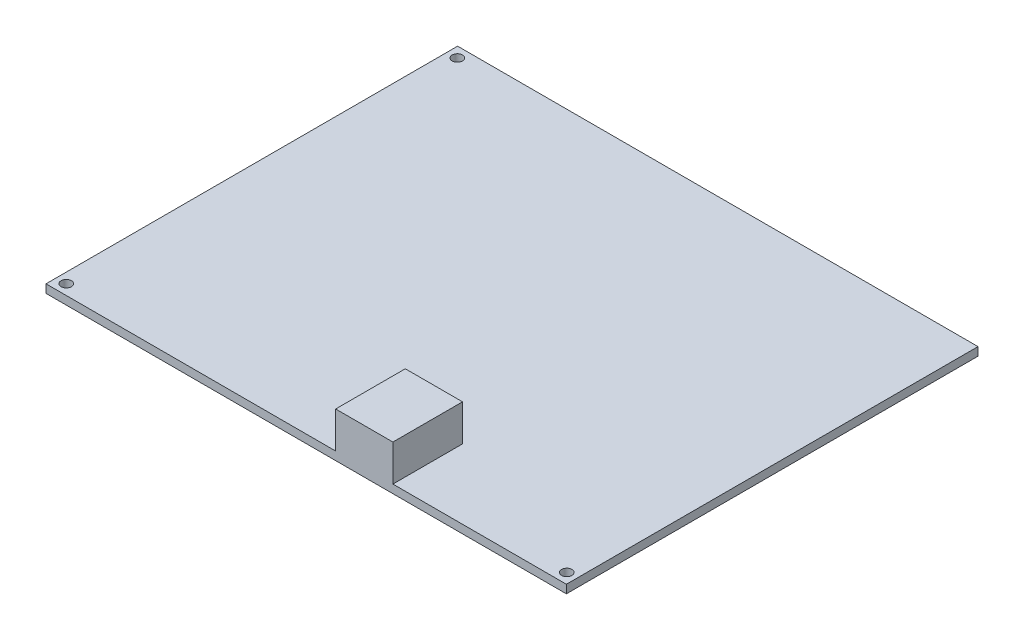
ISO-10303-21;
HEADER;
FILE_DESCRIPTION(('STEP AP214'),'2;1');
FILE_NAME('part.step','',(''),(''),'','','');
FILE_SCHEMA(('AUTOMOTIVE_DESIGN { 1 0 10303 214 1 1 1 1 }'));
ENDSEC;
DATA;
#1=APPLICATION_CONTEXT('core data for automotive mechanical design processes');
#2=APPLICATION_PROTOCOL_DEFINITION('international standard','automotive_design',2000,#1);
#3=PRODUCT_CONTEXT('',#1,'mechanical');
#4=PRODUCT('Part','Part','',(#3));
#5=PRODUCT_RELATED_PRODUCT_CATEGORY('part','',(#4));
#6=PRODUCT_DEFINITION_FORMATION('','',#4);
#7=PRODUCT_DEFINITION_CONTEXT('part definition',#1,'design');
#8=PRODUCT_DEFINITION('design','',#6,#7);
#9=PRODUCT_DEFINITION_SHAPE('','',#8);
#10=(LENGTH_UNIT() NAMED_UNIT(*) SI_UNIT(.MILLI.,.METRE.));
#11=(NAMED_UNIT(*) PLANE_ANGLE_UNIT() SI_UNIT($,.RADIAN.));
#12=(NAMED_UNIT(*) SI_UNIT($,.STERADIAN.) SOLID_ANGLE_UNIT());
#13=UNCERTAINTY_MEASURE_WITH_UNIT(LENGTH_MEASURE(1.E-05),#10,'distance_accuracy_value','');
#14=(GEOMETRIC_REPRESENTATION_CONTEXT(3) GLOBAL_UNCERTAINTY_ASSIGNED_CONTEXT((#13)) GLOBAL_UNIT_ASSIGNED_CONTEXT((#10,
#11,#12)) REPRESENTATION_CONTEXT('',''));
#15=CARTESIAN_POINT('',(0.,0.,0.));
#16=DIRECTION('',(0.,0.,1.));
#17=DIRECTION('',(1.,0.,0.));
#18=AXIS2_PLACEMENT_3D('',#15,#16,#17);
#19=CARTESIAN_POINT('',(0.,1.6,0.));
#20=DIRECTION('',(0.,-1.,0.));
#21=DIRECTION('',(0.,0.,-1.));
#22=AXIS2_PLACEMENT_3D('',#19,#20,#21);
#23=PLANE('',#22);
#24=CARTESIAN_POINT('',(98.066,1.6,-2.005));
#25=DIRECTION('',(0.,1.,0.));
#26=DIRECTION('',(0.,0.,1.));
#27=AXIS2_PLACEMENT_3D('',#24,#25,#26);
#28=CIRCLE('',#27,0.999999999999998);
#29=CARTESIAN_POINT('',(98.066,1.6,-1.005));
#30=VERTEX_POINT('',#29);
#31=EDGE_CURVE('E140',#30,#30,#28,.T.);
#32=ORIENTED_EDGE('',*,*,#31,.F.);
#33=EDGE_LOOP('',(#32));
#34=FACE_BOUND('',#33,.T.);
#35=CARTESIAN_POINT('',(1.93,1.6,-1.968));
#36=DIRECTION('',(0.,1.,0.));
#37=DIRECTION('',(0.,0.,1.));
#38=AXIS2_PLACEMENT_3D('',#35,#36,#37);
#39=CIRCLE('',#38,1.);
#40=CARTESIAN_POINT('',(1.93,1.6,-0.967999999999998));
#41=VERTEX_POINT('',#40);
#42=EDGE_CURVE('E151',#41,#41,#39,.T.);
#43=ORIENTED_EDGE('',*,*,#42,.F.);
#44=EDGE_LOOP('',(#43));
#45=FACE_BOUND('',#44,.T.);
#46=CARTESIAN_POINT('',(1.942,1.6,-77.109));
#47=DIRECTION('',(0.,1.,0.));
#48=DIRECTION('',(0.,0.,1.));
#49=AXIS2_PLACEMENT_3D('',#46,#47,#48);
#50=CIRCLE('',#49,1.);
#51=CARTESIAN_POINT('',(1.942,1.6,-76.109));
#52=VERTEX_POINT('',#51);
#53=EDGE_CURVE('E159',#52,#52,#50,.T.);
#54=ORIENTED_EDGE('',*,*,#53,.F.);
#55=EDGE_LOOP('',(#54));
#56=FACE_BOUND('',#55,.T.);
#57=DIRECTION('',(0.,0.,1.));
#58=VECTOR('',#57,1.);
#59=CARTESIAN_POINT('',(55.663,1.6,0.));
#60=LINE('',#59,#58);
#61=CARTESIAN_POINT('',(55.663,1.6,-13.382));
#62=VERTEX_POINT('',#61);
#63=CARTESIAN_POINT('',(55.663,1.6,0.));
#64=VERTEX_POINT('',#63);
#65=EDGE_CURVE('E61',#62,#64,#60,.T.);
#66=ORIENTED_EDGE('',*,*,#65,.F.);
#67=DIRECTION('',(-1.,0.,0.));
#68=VECTOR('',#67,1.);
#69=CARTESIAN_POINT('',(55.663,1.6,-13.382));
#70=LINE('',#69,#68);
#71=CARTESIAN_POINT('',(66.663,1.6,-13.382));
#72=VERTEX_POINT('',#71);
#73=EDGE_CURVE('E131',#72,#62,#70,.T.);
#74=ORIENTED_EDGE('',*,*,#73,.F.);
#75=DIRECTION('',(0.,0.,-1.));
#76=VECTOR('',#75,1.);
#77=CARTESIAN_POINT('',(66.663,1.6,0.));
#78=LINE('',#77,#76);
#79=CARTESIAN_POINT('',(66.663,1.6,0.));
#80=VERTEX_POINT('',#79);
#81=EDGE_CURVE('E67',#80,#72,#78,.T.);
#82=ORIENTED_EDGE('',*,*,#81,.F.);
#83=DIRECTION('',(1.,0.,0.));
#84=VECTOR('',#83,1.);
#85=CARTESIAN_POINT('',(0.,1.6,0.));
#86=LINE('',#85,#84);
#87=CARTESIAN_POINT('',(100.,1.6,0.));
#88=VERTEX_POINT('',#87);
#89=EDGE_CURVE('E171',#80,#88,#86,.T.);
#90=ORIENTED_EDGE('',*,*,#89,.T.);
#91=DIRECTION('',(0.,0.,-1.));
#92=VECTOR('',#91,1.);
#93=CARTESIAN_POINT('',(100.,1.6,0.));
#94=LINE('',#93,#92);
#95=CARTESIAN_POINT('',(100.,1.6,-79.1));
#96=VERTEX_POINT('',#95);
#97=EDGE_CURVE('E176',#88,#96,#94,.T.);
#98=ORIENTED_EDGE('',*,*,#97,.T.);
#99=DIRECTION('',(-1.,0.,0.));
#100=VECTOR('',#99,1.);
#101=CARTESIAN_POINT('',(0.,1.6,-79.1));
#102=LINE('',#101,#100);
#103=CARTESIAN_POINT('',(0.,1.6,-79.1));
#104=VERTEX_POINT('',#103);
#105=EDGE_CURVE('E179',#96,#104,#102,.T.);
#106=ORIENTED_EDGE('',*,*,#105,.T.);
#107=DIRECTION('',(0.,0.,1.));
#108=VECTOR('',#107,1.);
#109=CARTESIAN_POINT('',(0.,1.6,0.));
#110=LINE('',#109,#108);
#111=CARTESIAN_POINT('',(0.,1.6,0.));
#112=VERTEX_POINT('',#111);
#113=EDGE_CURVE('E167',#104,#112,#110,.T.);
#114=ORIENTED_EDGE('',*,*,#113,.T.);
#115=EDGE_CURVE('E173',#112,#64,#86,.T.);
#116=ORIENTED_EDGE('',*,*,#115,.T.);
#117=EDGE_LOOP('',(#66,#74,#82,#90,#98,#106,#114,#116));
#118=FACE_BOUND('',#117,.T.);
#119=ADVANCED_FACE('F45',(#34,#45,#56,#118),#23,.F.);
#120=CARTESIAN_POINT('',(0.,0.,0.));
#121=DIRECTION('',(0.,-1.,0.));
#122=DIRECTION('',(0.,0.,-1.));
#123=AXIS2_PLACEMENT_3D('',#120,#121,#122);
#124=PLANE('',#123);
#125=CARTESIAN_POINT('',(1.93,0.,-1.968));
#126=DIRECTION('',(0.,1.,0.));
#127=DIRECTION('',(0.,0.,1.));
#128=AXIS2_PLACEMENT_3D('',#125,#126,#127);
#129=CIRCLE('',#128,1.);
#130=CARTESIAN_POINT('',(1.93,0.,-0.967999999999998));
#131=VERTEX_POINT('',#130);
#132=EDGE_CURVE('E149',#131,#131,#129,.T.);
#133=ORIENTED_EDGE('',*,*,#132,.T.);
#134=EDGE_LOOP('',(#133));
#135=FACE_BOUND('',#134,.T.);
#136=DIRECTION('',(0.,0.,1.));
#137=VECTOR('',#136,1.);
#138=CARTESIAN_POINT('',(0.,0.,0.));
#139=LINE('',#138,#137);
#140=CARTESIAN_POINT('',(0.,0.,-79.1));
#141=VERTEX_POINT('',#140);
#142=CARTESIAN_POINT('',(0.,0.,0.));
#143=VERTEX_POINT('',#142);
#144=EDGE_CURVE('E163',#141,#143,#139,.T.);
#145=ORIENTED_EDGE('',*,*,#144,.F.);
#146=DIRECTION('',(-1.,0.,0.));
#147=VECTOR('',#146,1.);
#148=CARTESIAN_POINT('',(0.,0.,-79.1));
#149=LINE('',#148,#147);
#150=CARTESIAN_POINT('',(100.,0.,-79.1));
#151=VERTEX_POINT('',#150);
#152=EDGE_CURVE('E172',#151,#141,#149,.T.);
#153=ORIENTED_EDGE('',*,*,#152,.F.);
#154=DIRECTION('',(0.,0.,-1.));
#155=VECTOR('',#154,1.);
#156=CARTESIAN_POINT('',(100.,0.,0.));
#157=LINE('',#156,#155);
#158=CARTESIAN_POINT('',(100.,0.,0.));
#159=VERTEX_POINT('',#158);
#160=EDGE_CURVE('E189',#159,#151,#157,.T.);
#161=ORIENTED_EDGE('',*,*,#160,.F.);
#162=DIRECTION('',(1.,0.,0.));
#163=VECTOR('',#162,1.);
#164=CARTESIAN_POINT('',(0.,0.,0.));
#165=LINE('',#164,#163);
#166=EDGE_CURVE('E186',#143,#159,#165,.T.);
#167=ORIENTED_EDGE('',*,*,#166,.F.);
#168=EDGE_LOOP('',(#145,#153,#161,#167));
#169=FACE_BOUND('',#168,.T.);
#170=CARTESIAN_POINT('',(1.942,0.,-77.109));
#171=DIRECTION('',(0.,1.,0.));
#172=DIRECTION('',(0.,0.,1.));
#173=AXIS2_PLACEMENT_3D('',#170,#171,#172);
#174=CIRCLE('',#173,1.);
#175=CARTESIAN_POINT('',(1.942,0.,-76.109));
#176=VERTEX_POINT('',#175);
#177=EDGE_CURVE('E155',#176,#176,#174,.T.);
#178=ORIENTED_EDGE('',*,*,#177,.T.);
#179=EDGE_LOOP('',(#178));
#180=FACE_BOUND('',#179,.T.);
#181=CARTESIAN_POINT('',(98.066,0.,-2.005));
#182=DIRECTION('',(0.,1.,0.));
#183=DIRECTION('',(0.,0.,1.));
#184=AXIS2_PLACEMENT_3D('',#181,#182,#183);
#185=CIRCLE('',#184,0.999999999999998);
#186=CARTESIAN_POINT('',(98.066,0.,-1.005));
#187=VERTEX_POINT('',#186);
#188=EDGE_CURVE('E135',#187,#187,#185,.T.);
#189=ORIENTED_EDGE('',*,*,#188,.T.);
#190=EDGE_LOOP('',(#189));
#191=FACE_BOUND('',#190,.T.);
#192=ADVANCED_FACE('F211',(#135,#169,#180,#191),#124,.T.);
#193=CARTESIAN_POINT('',(0.,1.6,0.));
#194=DIRECTION('',(1.,0.,0.));
#195=DIRECTION('',(0.,0.,-1.));
#196=AXIS2_PLACEMENT_3D('',#193,#194,#195);
#197=PLANE('',#196);
#198=ORIENTED_EDGE('',*,*,#144,.T.);
#199=DIRECTION('',(0.,-1.,0.));
#200=VECTOR('',#199,1.);
#201=CARTESIAN_POINT('',(0.,1.6,0.));
#202=LINE('',#201,#200);
#203=EDGE_CURVE('E11',#112,#143,#202,.T.);
#204=ORIENTED_EDGE('',*,*,#203,.F.);
#205=ORIENTED_EDGE('',*,*,#113,.F.);
#206=DIRECTION('',(0.,-1.,0.));
#207=VECTOR('',#206,1.);
#208=CARTESIAN_POINT('',(0.,1.6,-79.1));
#209=LINE('',#208,#207);
#210=EDGE_CURVE('E182',#104,#141,#209,.T.);
#211=ORIENTED_EDGE('',*,*,#210,.T.);
#212=EDGE_LOOP('',(#198,#204,#205,#211));
#213=FACE_BOUND('',#212,.T.);
#214=ADVANCED_FACE('F47',(#213),#197,.F.);
#215=CARTESIAN_POINT('',(0.,1.6,0.));
#216=DIRECTION('',(0.,0.,-1.));
#217=DIRECTION('',(-1.,0.,0.));
#218=AXIS2_PLACEMENT_3D('',#215,#216,#217);
#219=PLANE('',#218);
#220=ORIENTED_EDGE('',*,*,#166,.T.);
#221=DIRECTION('',(0.,-1.,0.));
#222=VECTOR('',#221,1.);
#223=CARTESIAN_POINT('',(100.,1.6,0.));
#224=LINE('',#223,#222);
#225=EDGE_CURVE('E54',#88,#159,#224,.T.);
#226=ORIENTED_EDGE('',*,*,#225,.F.);
#227=ORIENTED_EDGE('',*,*,#89,.F.);
#228=DIRECTION('',(0.,-1.,0.));
#229=VECTOR('',#228,1.);
#230=CARTESIAN_POINT('',(66.663,8.6,0.));
#231=LINE('',#230,#229);
#232=CARTESIAN_POINT('',(66.663,8.6,0.));
#233=VERTEX_POINT('',#232);
#234=EDGE_CURVE('E116',#233,#80,#231,.T.);
#235=ORIENTED_EDGE('',*,*,#234,.F.);
#236=DIRECTION('',(1.,0.,0.));
#237=VECTOR('',#236,1.);
#238=CARTESIAN_POINT('',(55.663,8.6,0.));
#239=LINE('',#238,#237);
#240=CARTESIAN_POINT('',(55.663,8.6,0.));
#241=VERTEX_POINT('',#240);
#242=EDGE_CURVE('E110',#241,#233,#239,.T.);
#243=ORIENTED_EDGE('',*,*,#242,.F.);
#244=DIRECTION('',(0.,-1.,0.));
#245=VECTOR('',#244,1.);
#246=CARTESIAN_POINT('',(55.663,8.6,0.));
#247=LINE('',#246,#245);
#248=EDGE_CURVE('E114',#241,#64,#247,.T.);
#249=ORIENTED_EDGE('',*,*,#248,.T.);
#250=ORIENTED_EDGE('',*,*,#115,.F.);
#251=ORIENTED_EDGE('',*,*,#203,.T.);
#252=EDGE_LOOP('',(#220,#226,#227,#235,#243,#249,#250,#251));
#253=FACE_BOUND('',#252,.T.);
#254=ADVANCED_FACE('F112',(#253),#219,.F.);
#255=CARTESIAN_POINT('',(100.,1.6,0.));
#256=DIRECTION('',(-1.,0.,0.));
#257=DIRECTION('',(0.,0.,1.));
#258=AXIS2_PLACEMENT_3D('',#255,#256,#257);
#259=PLANE('',#258);
#260=ORIENTED_EDGE('',*,*,#160,.T.);
#261=DIRECTION('',(0.,-1.,0.));
#262=VECTOR('',#261,1.);
#263=CARTESIAN_POINT('',(100.,1.6,-79.1));
#264=LINE('',#263,#262);
#265=EDGE_CURVE('E197',#96,#151,#264,.T.);
#266=ORIENTED_EDGE('',*,*,#265,.F.);
#267=ORIENTED_EDGE('',*,*,#97,.F.);
#268=ORIENTED_EDGE('',*,*,#225,.T.);
#269=EDGE_LOOP('',(#260,#266,#267,#268));
#270=FACE_BOUND('',#269,.T.);
#271=ADVANCED_FACE('F206',(#270),#259,.F.);
#272=CARTESIAN_POINT('',(0.,1.6,-79.1));
#273=DIRECTION('',(0.,0.,1.));
#274=DIRECTION('',(1.,0.,0.));
#275=AXIS2_PLACEMENT_3D('',#272,#273,#274);
#276=PLANE('',#275);
#277=ORIENTED_EDGE('',*,*,#152,.T.);
#278=ORIENTED_EDGE('',*,*,#210,.F.);
#279=ORIENTED_EDGE('',*,*,#105,.F.);
#280=ORIENTED_EDGE('',*,*,#265,.T.);
#281=EDGE_LOOP('',(#277,#278,#279,#280));
#282=FACE_BOUND('',#281,.T.);
#283=ADVANCED_FACE('F215',(#282),#276,.F.);
#284=CARTESIAN_POINT('',(1.942,1.6,-77.109));
#285=DIRECTION('',(0.,-1.,0.));
#286=DIRECTION('',(0.,0.,-1.));
#287=AXIS2_PLACEMENT_3D('',#284,#285,#286);
#288=CYLINDRICAL_SURFACE('',#287,1.);
#289=ORIENTED_EDGE('',*,*,#53,.T.);
#290=EDGE_LOOP('',(#289));
#291=FACE_BOUND('',#290,.T.);
#292=ORIENTED_EDGE('',*,*,#177,.F.);
#293=EDGE_LOOP('',(#292));
#294=FACE_BOUND('',#293,.T.);
#295=ADVANCED_FACE('F257',(#291,#294),#288,.F.);
#296=CARTESIAN_POINT('',(1.93,1.6,-1.968));
#297=DIRECTION('',(0.,-1.,0.));
#298=DIRECTION('',(0.,0.,-1.));
#299=AXIS2_PLACEMENT_3D('',#296,#297,#298);
#300=CYLINDRICAL_SURFACE('',#299,1.);
#301=ORIENTED_EDGE('',*,*,#42,.T.);
#302=EDGE_LOOP('',(#301));
#303=FACE_BOUND('',#302,.T.);
#304=ORIENTED_EDGE('',*,*,#132,.F.);
#305=EDGE_LOOP('',(#304));
#306=FACE_BOUND('',#305,.T.);
#307=ADVANCED_FACE('F300',(#303,#306),#300,.F.);
#308=CARTESIAN_POINT('',(98.066,1.6,-2.005));
#309=DIRECTION('',(0.,-1.,0.));
#310=DIRECTION('',(0.,0.,-1.));
#311=AXIS2_PLACEMENT_3D('',#308,#309,#310);
#312=CYLINDRICAL_SURFACE('',#311,0.999999999999998);
#313=ORIENTED_EDGE('',*,*,#31,.T.);
#314=EDGE_LOOP('',(#313));
#315=FACE_BOUND('',#314,.T.);
#316=ORIENTED_EDGE('',*,*,#188,.F.);
#317=EDGE_LOOP('',(#316));
#318=FACE_BOUND('',#317,.T.);
#319=ADVANCED_FACE('F308',(#315,#318),#312,.F.);
#320=CARTESIAN_POINT('',(55.663,8.6,0.));
#321=DIRECTION('',(1.,0.,0.));
#322=DIRECTION('',(0.,0.,-1.));
#323=AXIS2_PLACEMENT_3D('',#320,#321,#322);
#324=PLANE('',#323);
#325=ORIENTED_EDGE('',*,*,#65,.T.);
#326=ORIENTED_EDGE('',*,*,#248,.F.);
#327=DIRECTION('',(0.,0.,1.));
#328=VECTOR('',#327,1.);
#329=CARTESIAN_POINT('',(55.663,8.6,0.));
#330=LINE('',#329,#328);
#331=CARTESIAN_POINT('',(55.663,8.6,-13.382));
#332=VERTEX_POINT('',#331);
#333=EDGE_CURVE('E121',#332,#241,#330,.T.);
#334=ORIENTED_EDGE('',*,*,#333,.F.);
#335=DIRECTION('',(0.,-1.,0.));
#336=VECTOR('',#335,1.);
#337=CARTESIAN_POINT('',(55.663,8.6,-13.382));
#338=LINE('',#337,#336);
#339=EDGE_CURVE('E222',#332,#62,#338,.T.);
#340=ORIENTED_EDGE('',*,*,#339,.T.);
#341=EDGE_LOOP('',(#325,#326,#334,#340));
#342=FACE_BOUND('',#341,.T.);
#343=ADVANCED_FACE('F133',(#342),#324,.F.);
#344=CARTESIAN_POINT('',(66.663,8.6,0.));
#345=DIRECTION('',(-1.,0.,0.));
#346=DIRECTION('',(0.,0.,1.));
#347=AXIS2_PLACEMENT_3D('',#344,#345,#346);
#348=PLANE('',#347);
#349=ORIENTED_EDGE('',*,*,#81,.T.);
#350=DIRECTION('',(0.,-1.,0.));
#351=VECTOR('',#350,1.);
#352=CARTESIAN_POINT('',(66.663,8.6,-13.382));
#353=LINE('',#352,#351);
#354=CARTESIAN_POINT('',(66.663,8.6,-13.382));
#355=VERTEX_POINT('',#354);
#356=EDGE_CURVE('E143',#355,#72,#353,.T.);
#357=ORIENTED_EDGE('',*,*,#356,.F.);
#358=DIRECTION('',(0.,0.,-1.));
#359=VECTOR('',#358,1.);
#360=CARTESIAN_POINT('',(66.663,8.6,0.));
#361=LINE('',#360,#359);
#362=EDGE_CURVE('E120',#233,#355,#361,.T.);
#363=ORIENTED_EDGE('',*,*,#362,.F.);
#364=ORIENTED_EDGE('',*,*,#234,.T.);
#365=EDGE_LOOP('',(#349,#357,#363,#364));
#366=FACE_BOUND('',#365,.T.);
#367=ADVANCED_FACE('F238',(#366),#348,.F.);
#368=CARTESIAN_POINT('',(55.663,8.6,-13.382));
#369=DIRECTION('',(0.,0.,1.));
#370=DIRECTION('',(1.,0.,0.));
#371=AXIS2_PLACEMENT_3D('',#368,#369,#370);
#372=PLANE('',#371);
#373=ORIENTED_EDGE('',*,*,#73,.T.);
#374=ORIENTED_EDGE('',*,*,#339,.F.);
#375=DIRECTION('',(-1.,0.,0.));
#376=VECTOR('',#375,1.);
#377=CARTESIAN_POINT('',(55.663,8.6,-13.382));
#378=LINE('',#377,#376);
#379=EDGE_CURVE('E126',#355,#332,#378,.T.);
#380=ORIENTED_EDGE('',*,*,#379,.F.);
#381=ORIENTED_EDGE('',*,*,#356,.T.);
#382=EDGE_LOOP('',(#373,#374,#380,#381));
#383=FACE_BOUND('',#382,.T.);
#384=ADVANCED_FACE('F239',(#383),#372,.F.);
#385=CARTESIAN_POINT('',(0.,8.6,0.));
#386=DIRECTION('',(0.,-1.,0.));
#387=DIRECTION('',(0.,0.,-1.));
#388=AXIS2_PLACEMENT_3D('',#385,#386,#387);
#389=PLANE('',#388);
#390=ORIENTED_EDGE('',*,*,#333,.T.);
#391=ORIENTED_EDGE('',*,*,#242,.T.);
#392=ORIENTED_EDGE('',*,*,#362,.T.);
#393=ORIENTED_EDGE('',*,*,#379,.T.);
#394=EDGE_LOOP('',(#390,#391,#392,#393));
#395=FACE_BOUND('',#394,.T.);
#396=ADVANCED_FACE('F124',(#395),#389,.F.);
#397=CLOSED_SHELL('',(#119,#192,#214,#254,#271,#283,#295,#307,#319,#343,#367,#384,#396));
#398=MANIFOLD_SOLID_BREP('B2',#397);
#399=ADVANCED_BREP_SHAPE_REPRESENTATION('',(#18,#398),#14);
#400=SHAPE_DEFINITION_REPRESENTATION(#9,#399);
ENDSEC;
END-ISO-10303-21;
